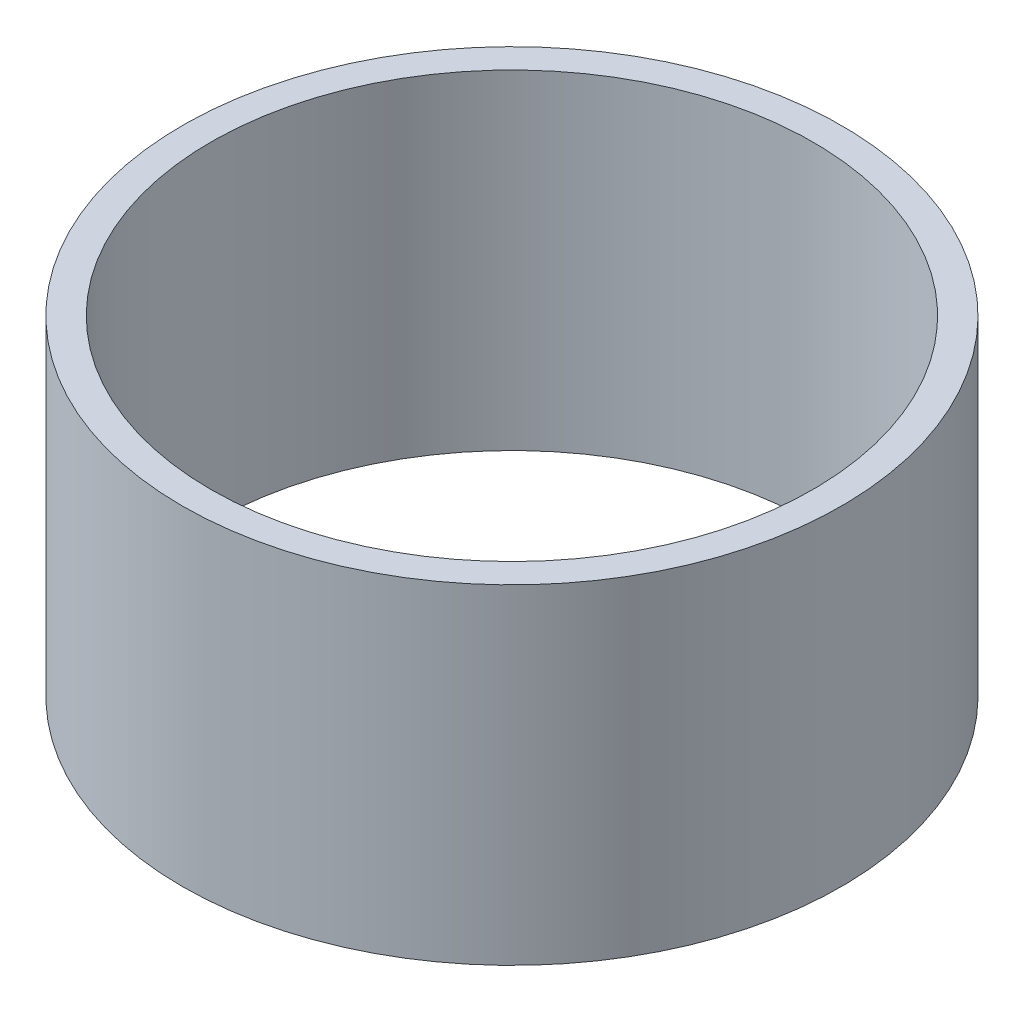
ISO-10303-21;
HEADER;
FILE_DESCRIPTION(('STEP AP214'),'2;1');
FILE_NAME('part.step','',(''),(''),'','','');
FILE_SCHEMA(('AUTOMOTIVE_DESIGN { 1 0 10303 214 1 1 1 1 }'));
ENDSEC;
DATA;
#1=APPLICATION_CONTEXT('core data for automotive mechanical design processes');
#2=APPLICATION_PROTOCOL_DEFINITION('international standard','automotive_design',2000,#1);
#3=PRODUCT_CONTEXT('',#1,'mechanical');
#4=PRODUCT('Part','Part','',(#3));
#5=PRODUCT_RELATED_PRODUCT_CATEGORY('part','',(#4));
#6=PRODUCT_DEFINITION_FORMATION('','',#4);
#7=PRODUCT_DEFINITION_CONTEXT('part definition',#1,'design');
#8=PRODUCT_DEFINITION('design','',#6,#7);
#9=PRODUCT_DEFINITION_SHAPE('','',#8);
#10=(LENGTH_UNIT() NAMED_UNIT(*) SI_UNIT(.MILLI.,.METRE.));
#11=(NAMED_UNIT(*) PLANE_ANGLE_UNIT() SI_UNIT($,.RADIAN.));
#12=(NAMED_UNIT(*) SI_UNIT($,.STERADIAN.) SOLID_ANGLE_UNIT());
#13=UNCERTAINTY_MEASURE_WITH_UNIT(LENGTH_MEASURE(1.E-05),#10,'distance_accuracy_value','');
#14=(GEOMETRIC_REPRESENTATION_CONTEXT(3) GLOBAL_UNCERTAINTY_ASSIGNED_CONTEXT((#13)) GLOBAL_UNIT_ASSIGNED_CONTEXT((#10,
#11,#12)) REPRESENTATION_CONTEXT('',''));
#15=CARTESIAN_POINT('',(0.,0.,0.));
#16=DIRECTION('',(0.,0.,1.));
#17=DIRECTION('',(1.,0.,0.));
#18=AXIS2_PLACEMENT_3D('',#15,#16,#17);
#19=CARTESIAN_POINT('',(0.,-9.525,0.));
#20=DIRECTION('',(0.,1.,0.));
#21=DIRECTION('',(0.,0.,1.));
#22=AXIS2_PLACEMENT_3D('',#19,#20,#21);
#23=CYLINDRICAL_SURFACE('',#22,19.05);
#24=CARTESIAN_POINT('',(0.,-9.525,0.));
#25=DIRECTION('',(0.,1.,0.));
#26=DIRECTION('',(0.,0.,1.));
#27=AXIS2_PLACEMENT_3D('',#24,#25,#26);
#28=CIRCLE('',#27,19.05);
#29=CARTESIAN_POINT('',(0.,-9.525,19.05));
#30=VERTEX_POINT('',#29);
#31=EDGE_CURVE('E10',#30,#30,#28,.T.);
#32=CARTESIAN_POINT('',(0.,9.525,0.));
#33=DIRECTION('',(0.,1.,0.));
#34=DIRECTION('',(0.,0.,1.));
#35=AXIS2_PLACEMENT_3D('',#32,#33,#34);
#36=CIRCLE('',#35,19.05);
#37=CARTESIAN_POINT('',(0.,9.525,19.05));
#38=VERTEX_POINT('',#37);
#39=EDGE_CURVE('E34',#38,#38,#36,.T.);
#40=CARTESIAN_POINT('',(0.,-9.525,19.05));
#41=CARTESIAN_POINT('',(0.,-9.3265625,19.05));
#42=CARTESIAN_POINT('',(0.,-9.128125,19.05));
#43=CARTESIAN_POINT('',(0.,-8.73125,19.05));
#44=CARTESIAN_POINT('',(0.,-8.5328125,19.05));
#45=CARTESIAN_POINT('',(0.,-8.1359375,19.05));
#46=CARTESIAN_POINT('',(0.,-7.9375,19.05));
#47=CARTESIAN_POINT('',(0.,-7.540625,19.05));
#48=CARTESIAN_POINT('',(0.,-7.3421875,19.05));
#49=CARTESIAN_POINT('',(0.,-6.9453125,19.05));
#50=CARTESIAN_POINT('',(0.,-6.746875,19.05));
#51=CARTESIAN_POINT('',(0.,-6.35,19.05));
#52=CARTESIAN_POINT('',(0.,-6.1515625,19.05));
#53=CARTESIAN_POINT('',(0.,-5.7546875,19.05));
#54=CARTESIAN_POINT('',(0.,-5.55625,19.05));
#55=CARTESIAN_POINT('',(0.,-5.159375,19.05));
#56=CARTESIAN_POINT('',(0.,-4.9609375,19.05));
#57=CARTESIAN_POINT('',(0.,-4.5640625,19.05));
#58=CARTESIAN_POINT('',(0.,-4.365625,19.05));
#59=CARTESIAN_POINT('',(0.,-3.96875,19.05));
#60=CARTESIAN_POINT('',(0.,-3.7703125,19.05));
#61=CARTESIAN_POINT('',(0.,-3.3734375,19.05));
#62=CARTESIAN_POINT('',(0.,-3.175,19.05));
#63=CARTESIAN_POINT('',(0.,-2.778125,19.05));
#64=CARTESIAN_POINT('',(0.,-2.5796875,19.05));
#65=CARTESIAN_POINT('',(0.,-2.1828125,19.05));
#66=CARTESIAN_POINT('',(0.,-1.984375,19.05));
#67=CARTESIAN_POINT('',(0.,-1.5875,19.05));
#68=CARTESIAN_POINT('',(0.,-1.3890625,19.05));
#69=CARTESIAN_POINT('',(0.,-0.992187500000001,19.05));
#70=CARTESIAN_POINT('',(0.,-0.793750000000001,19.05));
#71=CARTESIAN_POINT('',(0.,-0.396875,19.05));
#72=CARTESIAN_POINT('',(0.,-0.1984375,19.05));
#73=CARTESIAN_POINT('',(0.,0.1984375,19.05));
#74=CARTESIAN_POINT('',(0.,0.396875,19.05));
#75=CARTESIAN_POINT('',(0.,0.793750000000001,19.05));
#76=CARTESIAN_POINT('',(0.,0.992187500000001,19.05));
#77=CARTESIAN_POINT('',(0.,1.3890625,19.05));
#78=CARTESIAN_POINT('',(0.,1.5875,19.05));
#79=CARTESIAN_POINT('',(0.,1.984375,19.05));
#80=CARTESIAN_POINT('',(0.,2.1828125,19.05));
#81=CARTESIAN_POINT('',(0.,2.5796875,19.05));
#82=CARTESIAN_POINT('',(0.,2.778125,19.05));
#83=CARTESIAN_POINT('',(0.,3.175,19.05));
#84=CARTESIAN_POINT('',(0.,3.3734375,19.05));
#85=CARTESIAN_POINT('',(0.,3.7703125,19.05));
#86=CARTESIAN_POINT('',(0.,3.96875,19.05));
#87=CARTESIAN_POINT('',(0.,4.365625,19.05));
#88=CARTESIAN_POINT('',(0.,4.5640625,19.05));
#89=CARTESIAN_POINT('',(0.,4.9609375,19.05));
#90=CARTESIAN_POINT('',(0.,5.159375,19.05));
#91=CARTESIAN_POINT('',(0.,5.55625,19.05));
#92=CARTESIAN_POINT('',(0.,5.7546875,19.05));
#93=CARTESIAN_POINT('',(0.,6.1515625,19.05));
#94=CARTESIAN_POINT('',(0.,6.35,19.05));
#95=CARTESIAN_POINT('',(0.,6.746875,19.05));
#96=CARTESIAN_POINT('',(0.,6.9453125,19.05));
#97=CARTESIAN_POINT('',(0.,7.3421875,19.05));
#98=CARTESIAN_POINT('',(0.,7.540625,19.05));
#99=CARTESIAN_POINT('',(0.,7.9375,19.05));
#100=CARTESIAN_POINT('',(0.,8.1359375,19.05));
#101=CARTESIAN_POINT('',(0.,8.5328125,19.05));
#102=CARTESIAN_POINT('',(0.,8.73125,19.05));
#103=CARTESIAN_POINT('',(0.,9.128125,19.05));
#104=CARTESIAN_POINT('',(0.,9.3265625,19.05));
#105=CARTESIAN_POINT('',(0.,9.525,19.05));
#106=B_SPLINE_CURVE_WITH_KNOTS('',3,(#40,#41,#42,#43,#44,#45,#46,#47,#48,#49,#50,#51,#52,#53,
#54,#55,#56,#57,#58,#59,#60,#61,#62,#63,#64,#65,#66,#67,#68,#69,#70,#71,#72,#73,#74,#75,#76,#77,
#78,#79,#80,#81,#82,#83,#84,#85,#86,#87,#88,#89,#90,#91,#92,#93,#94,#95,#96,#97,#98,#99,#100,
#101,#102,#103,#104,#105),.UNSPECIFIED.,.F.,.F.,(4,2,2,2,2,2,2,2,2,2,2,2,2,2,2,2,2,2,2,2,2,2,2,
2,2,2,2,2,2,2,2,2,4),(0.,0.595312499999999,1.190625,1.7859375,2.38125,2.9765625,3.571875,
4.1671875,4.7625,5.3578125,5.953125,6.5484375,7.14375,7.7390625,8.334375,8.9296875,9.525,
10.1203125,10.715625,11.3109375,11.90625,12.5015625,13.096875,13.6921875,14.2875,14.8828125,
15.478125,16.0734375,16.66875,17.2640625,17.859375,18.4546875,19.05),.UNSPECIFIED.);
#107=EDGE_CURVE('BSEAM28',#30,#38,#106,.T.);
#108=ORIENTED_EDGE('',*,*,#31,.T.);
#109=ORIENTED_EDGE('',*,*,#39,.F.);
#110=ORIENTED_EDGE('',*,*,#107,.T.);
#111=ORIENTED_EDGE('',*,*,#107,.F.);
#112=EDGE_LOOP('',(#108,#110,#109,#111));
#113=FACE_BOUND('',#112,.T.);
#114=ADVANCED_FACE('F28',(#113),#23,.T.);
#115=CARTESIAN_POINT('',(0.,-9.525,0.));
#116=DIRECTION('',(0.,1.,0.));
#117=DIRECTION('',(0.,0.,1.));
#118=AXIS2_PLACEMENT_3D('',#115,#116,#117);
#119=PLANE('',#118);
#120=CARTESIAN_POINT('',(0.,-9.525,0.));
#121=DIRECTION('',(0.,1.,0.));
#122=DIRECTION('',(0.,0.,1.));
#123=AXIS2_PLACEMENT_3D('',#120,#121,#122);
#124=CIRCLE('',#123,17.399);
#125=CARTESIAN_POINT('',(0.,-9.525,17.399));
#126=VERTEX_POINT('',#125);
#127=EDGE_CURVE('E38',#126,#126,#124,.T.);
#128=ORIENTED_EDGE('',*,*,#127,.T.);
#129=EDGE_LOOP('',(#128));
#130=FACE_BOUND('',#129,.T.);
#131=ORIENTED_EDGE('',*,*,#31,.F.);
#132=EDGE_LOOP('',(#131));
#133=FACE_BOUND('',#132,.T.);
#134=ADVANCED_FACE('F52',(#130,#133),#119,.F.);
#135=CARTESIAN_POINT('',(0.,9.525,0.));
#136=DIRECTION('',(0.,1.,0.));
#137=DIRECTION('',(0.,0.,1.));
#138=AXIS2_PLACEMENT_3D('',#135,#136,#137);
#139=PLANE('',#138);
#140=CARTESIAN_POINT('',(0.,9.525,0.));
#141=DIRECTION('',(0.,1.,0.));
#142=DIRECTION('',(0.,0.,1.));
#143=AXIS2_PLACEMENT_3D('',#140,#141,#142);
#144=CIRCLE('',#143,17.399);
#145=CARTESIAN_POINT('',(0.,9.525,17.399));
#146=VERTEX_POINT('',#145);
#147=EDGE_CURVE('E42',#146,#146,#144,.T.);
#148=ORIENTED_EDGE('',*,*,#147,.F.);
#149=EDGE_LOOP('',(#148));
#150=FACE_BOUND('',#149,.T.);
#151=ORIENTED_EDGE('',*,*,#39,.T.);
#152=EDGE_LOOP('',(#151));
#153=FACE_BOUND('',#152,.T.);
#154=ADVANCED_FACE('F50',(#150,#153),#139,.T.);
#155=CARTESIAN_POINT('',(0.,-9.525,0.));
#156=DIRECTION('',(0.,1.,0.));
#157=DIRECTION('',(0.,0.,1.));
#158=AXIS2_PLACEMENT_3D('',#155,#156,#157);
#159=CYLINDRICAL_SURFACE('',#158,17.399);
#160=CARTESIAN_POINT('',(0.,-9.525,17.399));
#161=CARTESIAN_POINT('',(0.,-9.3265625,17.399));
#162=CARTESIAN_POINT('',(0.,-9.128125,17.399));
#163=CARTESIAN_POINT('',(0.,-8.73125,17.399));
#164=CARTESIAN_POINT('',(0.,-8.5328125,17.399));
#165=CARTESIAN_POINT('',(0.,-8.1359375,17.399));
#166=CARTESIAN_POINT('',(0.,-7.9375,17.399));
#167=CARTESIAN_POINT('',(0.,-7.540625,17.399));
#168=CARTESIAN_POINT('',(0.,-7.3421875,17.399));
#169=CARTESIAN_POINT('',(0.,-6.9453125,17.399));
#170=CARTESIAN_POINT('',(0.,-6.746875,17.399));
#171=CARTESIAN_POINT('',(0.,-6.35,17.399));
#172=CARTESIAN_POINT('',(0.,-6.1515625,17.399));
#173=CARTESIAN_POINT('',(0.,-5.7546875,17.399));
#174=CARTESIAN_POINT('',(0.,-5.55625,17.399));
#175=CARTESIAN_POINT('',(0.,-5.159375,17.399));
#176=CARTESIAN_POINT('',(0.,-4.9609375,17.399));
#177=CARTESIAN_POINT('',(0.,-4.5640625,17.399));
#178=CARTESIAN_POINT('',(0.,-4.365625,17.399));
#179=CARTESIAN_POINT('',(0.,-3.96875,17.399));
#180=CARTESIAN_POINT('',(0.,-3.7703125,17.399));
#181=CARTESIAN_POINT('',(0.,-3.3734375,17.399));
#182=CARTESIAN_POINT('',(0.,-3.175,17.399));
#183=CARTESIAN_POINT('',(0.,-2.778125,17.399));
#184=CARTESIAN_POINT('',(0.,-2.5796875,17.399));
#185=CARTESIAN_POINT('',(0.,-2.1828125,17.399));
#186=CARTESIAN_POINT('',(0.,-1.984375,17.399));
#187=CARTESIAN_POINT('',(0.,-1.5875,17.399));
#188=CARTESIAN_POINT('',(0.,-1.3890625,17.399));
#189=CARTESIAN_POINT('',(0.,-0.992187500000001,17.399));
#190=CARTESIAN_POINT('',(0.,-0.793750000000001,17.399));
#191=CARTESIAN_POINT('',(0.,-0.396875,17.399));
#192=CARTESIAN_POINT('',(0.,-0.1984375,17.399));
#193=CARTESIAN_POINT('',(0.,0.1984375,17.399));
#194=CARTESIAN_POINT('',(0.,0.396875,17.399));
#195=CARTESIAN_POINT('',(0.,0.793750000000001,17.399));
#196=CARTESIAN_POINT('',(0.,0.992187500000001,17.399));
#197=CARTESIAN_POINT('',(0.,1.3890625,17.399));
#198=CARTESIAN_POINT('',(0.,1.5875,17.399));
#199=CARTESIAN_POINT('',(0.,1.984375,17.399));
#200=CARTESIAN_POINT('',(0.,2.1828125,17.399));
#201=CARTESIAN_POINT('',(0.,2.5796875,17.399));
#202=CARTESIAN_POINT('',(0.,2.778125,17.399));
#203=CARTESIAN_POINT('',(0.,3.175,17.399));
#204=CARTESIAN_POINT('',(0.,3.3734375,17.399));
#205=CARTESIAN_POINT('',(0.,3.7703125,17.399));
#206=CARTESIAN_POINT('',(0.,3.96875,17.399));
#207=CARTESIAN_POINT('',(0.,4.365625,17.399));
#208=CARTESIAN_POINT('',(0.,4.5640625,17.399));
#209=CARTESIAN_POINT('',(0.,4.9609375,17.399));
#210=CARTESIAN_POINT('',(0.,5.159375,17.399));
#211=CARTESIAN_POINT('',(0.,5.55625,17.399));
#212=CARTESIAN_POINT('',(0.,5.7546875,17.399));
#213=CARTESIAN_POINT('',(0.,6.1515625,17.399));
#214=CARTESIAN_POINT('',(0.,6.35,17.399));
#215=CARTESIAN_POINT('',(0.,6.746875,17.399));
#216=CARTESIAN_POINT('',(0.,6.9453125,17.399));
#217=CARTESIAN_POINT('',(0.,7.3421875,17.399));
#218=CARTESIAN_POINT('',(0.,7.540625,17.399));
#219=CARTESIAN_POINT('',(0.,7.9375,17.399));
#220=CARTESIAN_POINT('',(0.,8.1359375,17.399));
#221=CARTESIAN_POINT('',(0.,8.5328125,17.399));
#222=CARTESIAN_POINT('',(0.,8.73125,17.399));
#223=CARTESIAN_POINT('',(0.,9.128125,17.399));
#224=CARTESIAN_POINT('',(0.,9.3265625,17.399));
#225=CARTESIAN_POINT('',(0.,9.525,17.399));
#226=B_SPLINE_CURVE_WITH_KNOTS('',3,(#160,#161,#162,#163,#164,#165,#166,#167,#168,#169,#170,
#171,#172,#173,#174,#175,#176,#177,#178,#179,#180,#181,#182,#183,#184,#185,#186,#187,#188,#189,
#190,#191,#192,#193,#194,#195,#196,#197,#198,#199,#200,#201,#202,#203,#204,#205,#206,#207,#208,
#209,#210,#211,#212,#213,#214,#215,#216,#217,#218,#219,#220,#221,#222,#223,#224,#225),
.UNSPECIFIED.,.F.,.F.,(4,2,2,2,2,2,2,2,2,2,2,2,2,2,2,2,2,2,2,2,2,2,2,2,2,2,2,2,2,2,2,2,4),(0.,
0.595312499999999,1.190625,1.7859375,2.38125,2.9765625,3.571875,4.1671875,4.7625,5.3578125,
5.953125,6.5484375,7.14375,7.7390625,8.334375,8.9296875,9.525,10.1203125,10.715625,11.3109375,
11.90625,12.5015625,13.096875,13.6921875,14.2875,14.8828125,15.478125,16.0734375,16.66875,
17.2640625,17.859375,18.4546875,19.05),.UNSPECIFIED.);
#227=EDGE_CURVE('BSEAM48',#126,#146,#226,.T.);
#228=ORIENTED_EDGE('',*,*,#127,.F.);
#229=ORIENTED_EDGE('',*,*,#147,.T.);
#230=ORIENTED_EDGE('',*,*,#227,.T.);
#231=ORIENTED_EDGE('',*,*,#227,.F.);
#232=EDGE_LOOP('',(#228,#230,#229,#231));
#233=FACE_BOUND('',#232,.T.);
#234=ADVANCED_FACE('F48',(#233),#159,.F.);
#235=CLOSED_SHELL('',(#114,#134,#154,#234));
#236=MANIFOLD_SOLID_BREP('B2',#235);
#237=ADVANCED_BREP_SHAPE_REPRESENTATION('',(#18,#236),#14);
#238=SHAPE_DEFINITION_REPRESENTATION(#9,#237);
ENDSEC;
END-ISO-10303-21;
